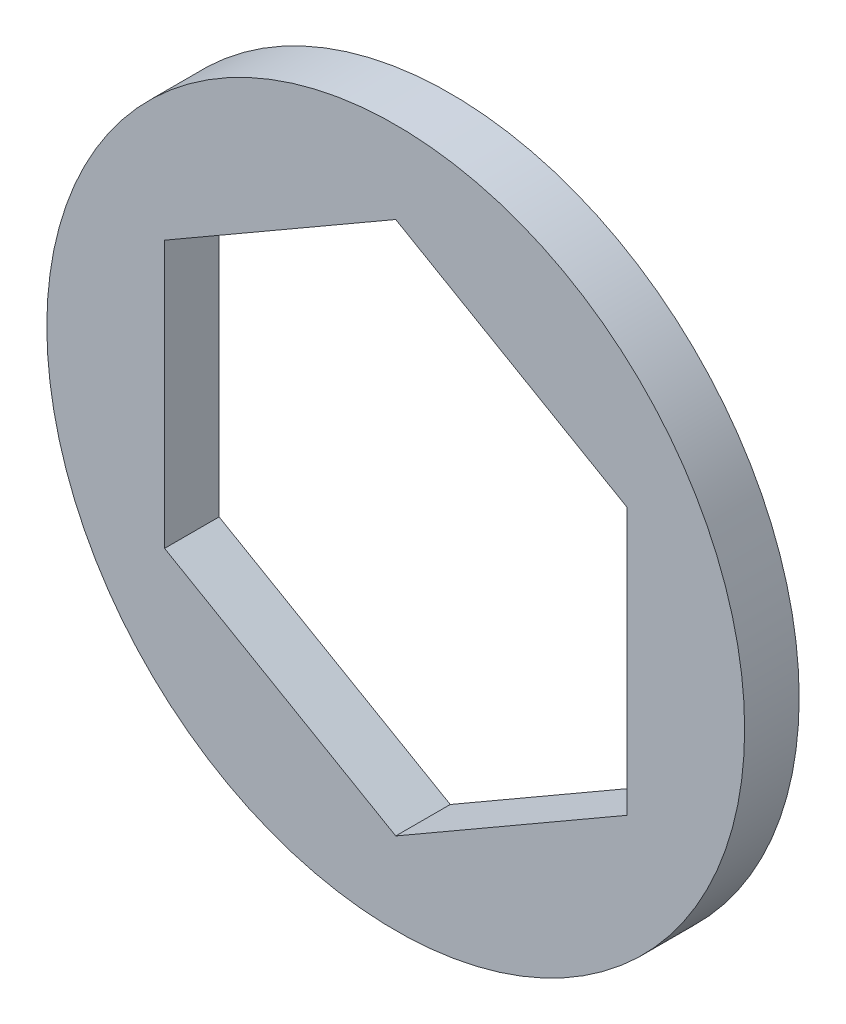
ISO-10303-21;
HEADER;
FILE_DESCRIPTION(('STEP AP214'),'2;1');
FILE_NAME('part.step','',(''),(''),'','','');
FILE_SCHEMA(('AUTOMOTIVE_DESIGN { 1 0 10303 214 1 1 1 1 }'));
ENDSEC;
DATA;
#1=APPLICATION_CONTEXT('core data for automotive mechanical design processes');
#2=APPLICATION_PROTOCOL_DEFINITION('international standard','automotive_design',2000,#1);
#3=PRODUCT_CONTEXT('',#1,'mechanical');
#4=PRODUCT('Part','Part','',(#3));
#5=PRODUCT_RELATED_PRODUCT_CATEGORY('part','',(#4));
#6=PRODUCT_DEFINITION_FORMATION('','',#4);
#7=PRODUCT_DEFINITION_CONTEXT('part definition',#1,'design');
#8=PRODUCT_DEFINITION('design','',#6,#7);
#9=PRODUCT_DEFINITION_SHAPE('','',#8);
#10=(LENGTH_UNIT() NAMED_UNIT(*) SI_UNIT(.MILLI.,.METRE.));
#11=(NAMED_UNIT(*) PLANE_ANGLE_UNIT() SI_UNIT($,.RADIAN.));
#12=(NAMED_UNIT(*) SI_UNIT($,.STERADIAN.) SOLID_ANGLE_UNIT());
#13=UNCERTAINTY_MEASURE_WITH_UNIT(LENGTH_MEASURE(1.E-05),#10,'distance_accuracy_value','');
#14=(GEOMETRIC_REPRESENTATION_CONTEXT(3) GLOBAL_UNCERTAINTY_ASSIGNED_CONTEXT((#13)) GLOBAL_UNIT_ASSIGNED_CONTEXT((#10,
#11,#12)) REPRESENTATION_CONTEXT('',''));
#15=CARTESIAN_POINT('',(0.,0.,0.));
#16=DIRECTION('',(0.,0.,1.));
#17=DIRECTION('',(1.,0.,0.));
#18=AXIS2_PLACEMENT_3D('',#15,#16,#17);
#19=CARTESIAN_POINT('',(0.,0.,1.5875));
#20=DIRECTION('',(0.,0.,1.));
#21=DIRECTION('',(1.,0.,0.));
#22=AXIS2_PLACEMENT_3D('',#19,#20,#21);
#23=PLANE('',#22);
#24=CARTESIAN_POINT('',(0.,0.,1.5875));
#25=DIRECTION('',(0.,0.,1.));
#26=DIRECTION('',(1.,0.,0.));
#27=AXIS2_PLACEMENT_3D('',#24,#25,#26);
#28=CIRCLE('',#27,10.16);
#29=CARTESIAN_POINT('',(10.16,0.,1.5875));
#30=VERTEX_POINT('',#29);
#31=EDGE_CURVE('E11',#30,#30,#28,.T.);
#32=ORIENTED_EDGE('',*,*,#31,.T.);
#33=EDGE_LOOP('',(#32));
#34=FACE_BOUND('',#33,.T.);
#35=DIRECTION('',(-0.866025403784439,0.5,0.));
#36=VECTOR('',#35,1.);
#37=CARTESIAN_POINT('',(6.731,3.88614466191537,1.5875));
#38=LINE('',#37,#36);
#39=CARTESIAN_POINT('',(6.731,3.88614466191537,1.5875));
#40=VERTEX_POINT('',#39);
#41=CARTESIAN_POINT('',(0.,7.77228932383074,1.5875));
#42=VERTEX_POINT('',#41);
#43=EDGE_CURVE('E100',#40,#42,#38,.T.);
#44=ORIENTED_EDGE('',*,*,#43,.F.);
#45=DIRECTION('',(0.,1.,0.));
#46=VECTOR('',#45,1.);
#47=CARTESIAN_POINT('',(6.731,-3.88614466191537,1.5875));
#48=LINE('',#47,#46);
#49=CARTESIAN_POINT('',(6.731,-3.88614466191537,1.5875));
#50=VERTEX_POINT('',#49);
#51=EDGE_CURVE('E92',#50,#40,#48,.T.);
#52=ORIENTED_EDGE('',*,*,#51,.F.);
#53=DIRECTION('',(0.866025403784439,0.5,0.));
#54=VECTOR('',#53,1.);
#55=CARTESIAN_POINT('',(0.,-7.77228932383074,1.5875));
#56=LINE('',#55,#54);
#57=CARTESIAN_POINT('',(0.,-7.77228932383074,1.5875));
#58=VERTEX_POINT('',#57);
#59=EDGE_CURVE('E120',#58,#50,#56,.T.);
#60=ORIENTED_EDGE('',*,*,#59,.F.);
#61=DIRECTION('',(0.866025403784439,-0.5,0.));
#62=VECTOR('',#61,1.);
#63=CARTESIAN_POINT('',(-6.731,-3.88614466191537,1.5875));
#64=LINE('',#63,#62);
#65=CARTESIAN_POINT('',(-6.731,-3.88614466191537,1.5875));
#66=VERTEX_POINT('',#65);
#67=EDGE_CURVE('E118',#66,#58,#64,.T.);
#68=ORIENTED_EDGE('',*,*,#67,.F.);
#69=DIRECTION('',(0.,-1.,0.));
#70=VECTOR('',#69,1.);
#71=CARTESIAN_POINT('',(-6.731,3.88614466191537,1.5875));
#72=LINE('',#71,#70);
#73=CARTESIAN_POINT('',(-6.731,3.88614466191537,1.5875));
#74=VERTEX_POINT('',#73);
#75=EDGE_CURVE('E114',#74,#66,#72,.T.);
#76=ORIENTED_EDGE('',*,*,#75,.F.);
#77=DIRECTION('',(-0.866025403784439,-0.5,0.));
#78=VECTOR('',#77,1.);
#79=CARTESIAN_POINT('',(0.,7.77228932383074,1.5875));
#80=LINE('',#79,#78);
#81=EDGE_CURVE('E112',#42,#74,#80,.T.);
#82=ORIENTED_EDGE('',*,*,#81,.F.);
#83=EDGE_LOOP('',(#44,#52,#60,#68,#76,#82));
#84=FACE_BOUND('',#83,.T.);
#85=ADVANCED_FACE('F39',(#34,#84),#23,.T.);
#86=CARTESIAN_POINT('',(0.,0.,0.));
#87=DIRECTION('',(0.,0.,1.));
#88=DIRECTION('',(1.,0.,0.));
#89=AXIS2_PLACEMENT_3D('',#86,#87,#88);
#90=PLANE('',#89);
#91=CARTESIAN_POINT('',(0.,0.,0.));
#92=DIRECTION('',(0.,0.,1.));
#93=DIRECTION('',(1.,0.,0.));
#94=AXIS2_PLACEMENT_3D('',#91,#92,#93);
#95=CIRCLE('',#94,10.16);
#96=CARTESIAN_POINT('',(10.16,0.,0.));
#97=VERTEX_POINT('',#96);
#98=EDGE_CURVE('E43',#97,#97,#95,.T.);
#99=ORIENTED_EDGE('',*,*,#98,.F.);
#100=EDGE_LOOP('',(#99));
#101=FACE_BOUND('',#100,.T.);
#102=DIRECTION('',(0.,1.,0.));
#103=VECTOR('',#102,1.);
#104=CARTESIAN_POINT('',(6.731,-3.88614466191537,0.));
#105=LINE('',#104,#103);
#106=CARTESIAN_POINT('',(6.731,-3.88614466191537,0.));
#107=VERTEX_POINT('',#106);
#108=CARTESIAN_POINT('',(6.731,3.88614466191537,0.));
#109=VERTEX_POINT('',#108);
#110=EDGE_CURVE('E62',#107,#109,#105,.T.);
#111=ORIENTED_EDGE('',*,*,#110,.T.);
#112=DIRECTION('',(-0.866025403784439,0.5,0.));
#113=VECTOR('',#112,1.);
#114=CARTESIAN_POINT('',(6.731,3.88614466191537,0.));
#115=LINE('',#114,#113);
#116=CARTESIAN_POINT('',(0.,7.77228932383074,0.));
#117=VERTEX_POINT('',#116);
#118=EDGE_CURVE('E107',#109,#117,#115,.T.);
#119=ORIENTED_EDGE('',*,*,#118,.T.);
#120=DIRECTION('',(-0.866025403784439,-0.5,0.));
#121=VECTOR('',#120,1.);
#122=CARTESIAN_POINT('',(0.,7.77228932383074,0.));
#123=LINE('',#122,#121);
#124=CARTESIAN_POINT('',(-6.731,3.88614466191537,0.));
#125=VERTEX_POINT('',#124);
#126=EDGE_CURVE('E124',#117,#125,#123,.T.);
#127=ORIENTED_EDGE('',*,*,#126,.T.);
#128=DIRECTION('',(0.,-1.,0.));
#129=VECTOR('',#128,1.);
#130=CARTESIAN_POINT('',(-6.731,3.88614466191537,0.));
#131=LINE('',#130,#129);
#132=CARTESIAN_POINT('',(-6.731,-3.88614466191537,0.));
#133=VERTEX_POINT('',#132);
#134=EDGE_CURVE('E127',#125,#133,#131,.T.);
#135=ORIENTED_EDGE('',*,*,#134,.T.);
#136=DIRECTION('',(0.866025403784439,-0.5,0.));
#137=VECTOR('',#136,1.);
#138=CARTESIAN_POINT('',(-6.731,-3.88614466191537,0.));
#139=LINE('',#138,#137);
#140=CARTESIAN_POINT('',(0.,-7.77228932383074,0.));
#141=VERTEX_POINT('',#140);
#142=EDGE_CURVE('E130',#133,#141,#139,.T.);
#143=ORIENTED_EDGE('',*,*,#142,.T.);
#144=DIRECTION('',(0.866025403784439,0.5,0.));
#145=VECTOR('',#144,1.);
#146=CARTESIAN_POINT('',(0.,-7.77228932383074,0.));
#147=LINE('',#146,#145);
#148=EDGE_CURVE('E101',#141,#107,#147,.T.);
#149=ORIENTED_EDGE('',*,*,#148,.T.);
#150=EDGE_LOOP('',(#111,#119,#127,#135,#143,#149));
#151=FACE_BOUND('',#150,.T.);
#152=ADVANCED_FACE('F147',(#101,#151),#90,.F.);
#153=CARTESIAN_POINT('',(0.,0.,1.5875));
#154=DIRECTION('',(0.,0.,-1.));
#155=DIRECTION('',(-1.,0.,0.));
#156=AXIS2_PLACEMENT_3D('',#153,#154,#155);
#157=CYLINDRICAL_SURFACE('',#156,10.16);
#158=ORIENTED_EDGE('',*,*,#31,.F.);
#159=EDGE_LOOP('',(#158));
#160=FACE_BOUND('',#159,.T.);
#161=ORIENTED_EDGE('',*,*,#98,.T.);
#162=EDGE_LOOP('',(#161));
#163=FACE_BOUND('',#162,.T.);
#164=ADVANCED_FACE('F41',(#160,#163),#157,.T.);
#165=CARTESIAN_POINT('',(6.731,-3.88614466191537,1.5875));
#166=DIRECTION('',(-1.,0.,0.));
#167=DIRECTION('',(0.,-1.,0.));
#168=AXIS2_PLACEMENT_3D('',#165,#166,#167);
#169=PLANE('',#168);
#170=ORIENTED_EDGE('',*,*,#110,.F.);
#171=DIRECTION('',(0.,0.,-1.));
#172=VECTOR('',#171,1.);
#173=CARTESIAN_POINT('',(6.731,-3.88614466191537,1.5875));
#174=LINE('',#173,#172);
#175=EDGE_CURVE('E96',#50,#107,#174,.T.);
#176=ORIENTED_EDGE('',*,*,#175,.F.);
#177=ORIENTED_EDGE('',*,*,#51,.T.);
#178=DIRECTION('',(0.,0.,-1.));
#179=VECTOR('',#178,1.);
#180=CARTESIAN_POINT('',(6.731,3.88614466191537,1.5875));
#181=LINE('',#180,#179);
#182=EDGE_CURVE('E95',#40,#109,#181,.T.);
#183=ORIENTED_EDGE('',*,*,#182,.T.);
#184=EDGE_LOOP('',(#170,#176,#177,#183));
#185=FACE_BOUND('',#184,.T.);
#186=ADVANCED_FACE('F94',(#185),#169,.T.);
#187=CARTESIAN_POINT('',(6.731,3.88614466191537,1.5875));
#188=DIRECTION('',(-0.5,-0.866025403784439,0.));
#189=DIRECTION('',(0.866025403784439,-0.5,0.));
#190=AXIS2_PLACEMENT_3D('',#187,#188,#189);
#191=PLANE('',#190);
#192=ORIENTED_EDGE('',*,*,#118,.F.);
#193=ORIENTED_EDGE('',*,*,#182,.F.);
#194=ORIENTED_EDGE('',*,*,#43,.T.);
#195=DIRECTION('',(0.,0.,-1.));
#196=VECTOR('',#195,1.);
#197=CARTESIAN_POINT('',(0.,7.77228932383074,1.5875));
#198=LINE('',#197,#196);
#199=EDGE_CURVE('E108',#42,#117,#198,.T.);
#200=ORIENTED_EDGE('',*,*,#199,.T.);
#201=EDGE_LOOP('',(#192,#193,#194,#200));
#202=FACE_BOUND('',#201,.T.);
#203=ADVANCED_FACE('F104',(#202),#191,.T.);
#204=CARTESIAN_POINT('',(0.,7.77228932383074,1.5875));
#205=DIRECTION('',(0.5,-0.866025403784439,0.));
#206=DIRECTION('',(0.866025403784439,0.5,0.));
#207=AXIS2_PLACEMENT_3D('',#204,#205,#206);
#208=PLANE('',#207);
#209=ORIENTED_EDGE('',*,*,#126,.F.);
#210=ORIENTED_EDGE('',*,*,#199,.F.);
#211=ORIENTED_EDGE('',*,*,#81,.T.);
#212=DIRECTION('',(0.,0.,-1.));
#213=VECTOR('',#212,1.);
#214=CARTESIAN_POINT('',(-6.731,3.88614466191537,1.5875));
#215=LINE('',#214,#213);
#216=EDGE_CURVE('E139',#74,#125,#215,.T.);
#217=ORIENTED_EDGE('',*,*,#216,.T.);
#218=EDGE_LOOP('',(#209,#210,#211,#217));
#219=FACE_BOUND('',#218,.T.);
#220=ADVANCED_FACE('F143',(#219),#208,.T.);
#221=CARTESIAN_POINT('',(-6.731,3.88614466191537,1.5875));
#222=DIRECTION('',(1.,0.,0.));
#223=DIRECTION('',(0.,1.,0.));
#224=AXIS2_PLACEMENT_3D('',#221,#222,#223);
#225=PLANE('',#224);
#226=ORIENTED_EDGE('',*,*,#134,.F.);
#227=ORIENTED_EDGE('',*,*,#216,.F.);
#228=ORIENTED_EDGE('',*,*,#75,.T.);
#229=DIRECTION('',(0.,0.,-1.));
#230=VECTOR('',#229,1.);
#231=CARTESIAN_POINT('',(-6.731,-3.88614466191537,1.5875));
#232=LINE('',#231,#230);
#233=EDGE_CURVE('E137',#66,#133,#232,.T.);
#234=ORIENTED_EDGE('',*,*,#233,.T.);
#235=EDGE_LOOP('',(#226,#227,#228,#234));
#236=FACE_BOUND('',#235,.T.);
#237=ADVANCED_FACE('F155',(#236),#225,.T.);
#238=CARTESIAN_POINT('',(-6.731,-3.88614466191537,1.5875));
#239=DIRECTION('',(0.5,0.866025403784439,0.));
#240=DIRECTION('',(-0.866025403784439,0.5,0.));
#241=AXIS2_PLACEMENT_3D('',#238,#239,#240);
#242=PLANE('',#241);
#243=ORIENTED_EDGE('',*,*,#142,.F.);
#244=ORIENTED_EDGE('',*,*,#233,.F.);
#245=ORIENTED_EDGE('',*,*,#67,.T.);
#246=DIRECTION('',(0.,0.,-1.));
#247=VECTOR('',#246,1.);
#248=CARTESIAN_POINT('',(0.,-7.77228932383074,1.5875));
#249=LINE('',#248,#247);
#250=EDGE_CURVE('E54',#58,#141,#249,.T.);
#251=ORIENTED_EDGE('',*,*,#250,.T.);
#252=EDGE_LOOP('',(#243,#244,#245,#251));
#253=FACE_BOUND('',#252,.T.);
#254=ADVANCED_FACE('F153',(#253),#242,.T.);
#255=CARTESIAN_POINT('',(0.,-7.77228932383074,1.5875));
#256=DIRECTION('',(-0.5,0.866025403784439,0.));
#257=DIRECTION('',(-0.866025403784439,-0.5,0.));
#258=AXIS2_PLACEMENT_3D('',#255,#256,#257);
#259=PLANE('',#258);
#260=ORIENTED_EDGE('',*,*,#148,.F.);
#261=ORIENTED_EDGE('',*,*,#250,.F.);
#262=ORIENTED_EDGE('',*,*,#59,.T.);
#263=ORIENTED_EDGE('',*,*,#175,.T.);
#264=EDGE_LOOP('',(#260,#261,#262,#263));
#265=FACE_BOUND('',#264,.T.);
#266=ADVANCED_FACE('F149',(#265),#259,.T.);
#267=CLOSED_SHELL('',(#85,#152,#164,#186,#203,#220,#237,#254,#266));
#268=MANIFOLD_SOLID_BREP('B2',#267);
#269=ADVANCED_BREP_SHAPE_REPRESENTATION('',(#18,#268),#14);
#270=SHAPE_DEFINITION_REPRESENTATION(#9,#269);
ENDSEC;
END-ISO-10303-21;
